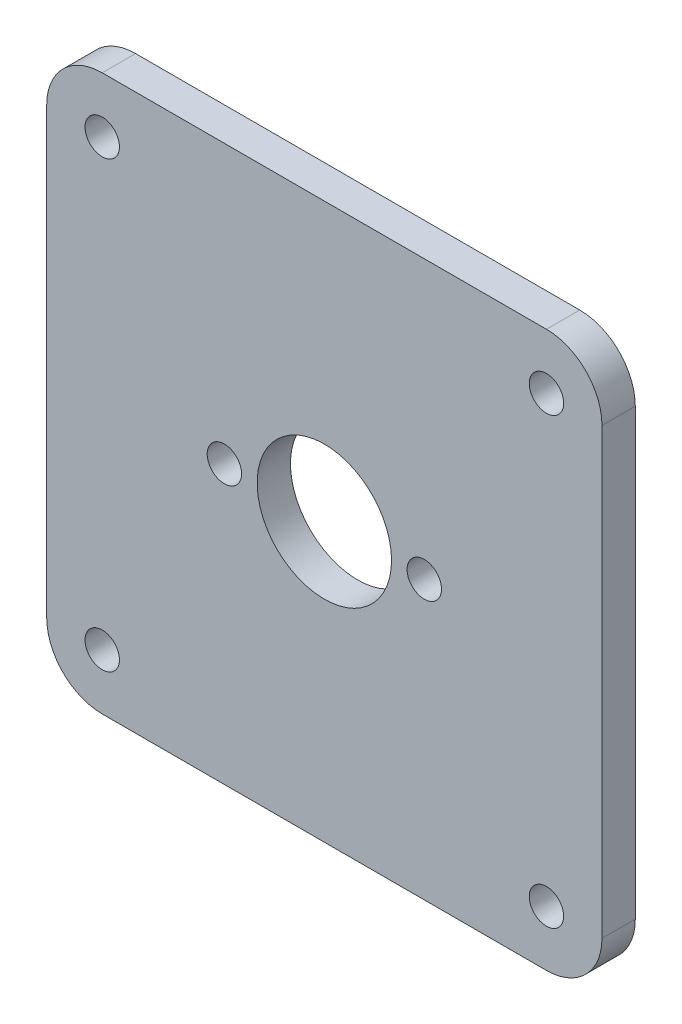
ISO-10303-21;
HEADER;
FILE_DESCRIPTION(('STEP AP214'),'2;1');
FILE_NAME('part.step','',(''),(''),'','','');
FILE_SCHEMA(('AUTOMOTIVE_DESIGN { 1 0 10303 214 1 1 1 1 }'));
ENDSEC;
DATA;
#1=APPLICATION_CONTEXT('core data for automotive mechanical design processes');
#2=APPLICATION_PROTOCOL_DEFINITION('international standard','automotive_design',2000,#1);
#3=PRODUCT_CONTEXT('',#1,'mechanical');
#4=PRODUCT('Part','Part','',(#3));
#5=PRODUCT_RELATED_PRODUCT_CATEGORY('part','',(#4));
#6=PRODUCT_DEFINITION_FORMATION('','',#4);
#7=PRODUCT_DEFINITION_CONTEXT('part definition',#1,'design');
#8=PRODUCT_DEFINITION('design','',#6,#7);
#9=PRODUCT_DEFINITION_SHAPE('','',#8);
#10=(LENGTH_UNIT() NAMED_UNIT(*) SI_UNIT(.MILLI.,.METRE.));
#11=(NAMED_UNIT(*) PLANE_ANGLE_UNIT() SI_UNIT($,.RADIAN.));
#12=(NAMED_UNIT(*) SI_UNIT($,.STERADIAN.) SOLID_ANGLE_UNIT());
#13=UNCERTAINTY_MEASURE_WITH_UNIT(LENGTH_MEASURE(1.E-05),#10,'distance_accuracy_value','');
#14=(GEOMETRIC_REPRESENTATION_CONTEXT(3) GLOBAL_UNCERTAINTY_ASSIGNED_CONTEXT((#13)) GLOBAL_UNIT_ASSIGNED_CONTEXT((#10,
#11,#12)) REPRESENTATION_CONTEXT('',''));
#15=CARTESIAN_POINT('',(0.,0.,0.));
#16=DIRECTION('',(0.,0.,1.));
#17=DIRECTION('',(1.,0.,0.));
#18=AXIS2_PLACEMENT_3D('',#15,#16,#17);
#19=CARTESIAN_POINT('',(0.,0.,3.));
#20=DIRECTION('',(0.,0.,1.));
#21=DIRECTION('',(1.,0.,0.));
#22=AXIS2_PLACEMENT_3D('',#19,#20,#21);
#23=PLANE('',#22);
#24=CARTESIAN_POINT('',(0.,0.,3.));
#25=DIRECTION('',(0.,0.,1.));
#26=DIRECTION('',(1.,0.,0.));
#27=AXIS2_PLACEMENT_3D('',#24,#25,#26);
#28=CIRCLE('',#27,6.05);
#29=CARTESIAN_POINT('',(6.05,0.,3.));
#30=VERTEX_POINT('',#29);
#31=EDGE_CURVE('E269',#30,#30,#28,.T.);
#32=ORIENTED_EDGE('',*,*,#31,.F.);
#33=EDGE_LOOP('',(#32));
#34=FACE_BOUND('',#33,.T.);
#35=CARTESIAN_POINT('',(20.,-20.,3.));
#36=DIRECTION('',(0.,0.,1.));
#37=DIRECTION('',(1.,0.,0.));
#38=AXIS2_PLACEMENT_3D('',#35,#36,#37);
#39=CIRCLE('',#38,1.55);
#40=CARTESIAN_POINT('',(21.55,-20.,3.));
#41=VERTEX_POINT('',#40);
#42=EDGE_CURVE('E285',#41,#41,#39,.T.);
#43=ORIENTED_EDGE('',*,*,#42,.F.);
#44=EDGE_LOOP('',(#43));
#45=FACE_BOUND('',#44,.T.);
#46=CARTESIAN_POINT('',(-9.,0.,3.));
#47=DIRECTION('',(0.,0.,1.));
#48=DIRECTION('',(1.,0.,0.));
#49=AXIS2_PLACEMENT_3D('',#46,#47,#48);
#50=CIRCLE('',#49,1.55);
#51=CARTESIAN_POINT('',(-7.45,0.,3.));
#52=VERTEX_POINT('',#51);
#53=EDGE_CURVE('E301',#52,#52,#50,.T.);
#54=ORIENTED_EDGE('',*,*,#53,.F.);
#55=EDGE_LOOP('',(#54));
#56=FACE_BOUND('',#55,.T.);
#57=DIRECTION('',(0.,-1.,0.));
#58=VECTOR('',#57,1.);
#59=CARTESIAN_POINT('',(-25.,25.,3.));
#60=LINE('',#59,#58);
#61=CARTESIAN_POINT('',(-25.,20.,3.));
#62=VERTEX_POINT('',#61);
#63=CARTESIAN_POINT('',(-25.,-20.,3.));
#64=VERTEX_POINT('',#63);
#65=EDGE_CURVE('E181',#62,#64,#60,.T.);
#66=ORIENTED_EDGE('',*,*,#65,.T.);
#67=CARTESIAN_POINT('',(-20.,-20.,3.));
#68=DIRECTION('',(0.,0.,1.));
#69=DIRECTION('',(1.,0.,0.));
#70=AXIS2_PLACEMENT_3D('',#67,#68,#69);
#71=CIRCLE('',#70,5.);
#72=CARTESIAN_POINT('',(-20.,-25.,3.));
#73=VERTEX_POINT('',#72);
#74=EDGE_CURVE('E169',#64,#73,#71,.T.);
#75=ORIENTED_EDGE('',*,*,#74,.T.);
#76=DIRECTION('',(1.,0.,0.));
#77=VECTOR('',#76,1.);
#78=CARTESIAN_POINT('',(-25.,-25.,3.));
#79=LINE('',#78,#77);
#80=CARTESIAN_POINT('',(20.,-25.,3.));
#81=VERTEX_POINT('',#80);
#82=EDGE_CURVE('E127',#73,#81,#79,.T.);
#83=ORIENTED_EDGE('',*,*,#82,.T.);
#84=CARTESIAN_POINT('',(20.,-20.,3.));
#85=DIRECTION('',(0.,0.,1.));
#86=DIRECTION('',(1.,0.,0.));
#87=AXIS2_PLACEMENT_3D('',#84,#85,#86);
#88=CIRCLE('',#87,5.);
#89=CARTESIAN_POINT('',(25.,-20.,3.));
#90=VERTEX_POINT('',#89);
#91=EDGE_CURVE('E166',#81,#90,#88,.T.);
#92=ORIENTED_EDGE('',*,*,#91,.T.);
#93=DIRECTION('',(0.,1.,0.));
#94=VECTOR('',#93,1.);
#95=CARTESIAN_POINT('',(25.,25.,3.));
#96=LINE('',#95,#94);
#97=CARTESIAN_POINT('',(25.,20.,3.));
#98=VERTEX_POINT('',#97);
#99=EDGE_CURVE('E136',#90,#98,#96,.T.);
#100=ORIENTED_EDGE('',*,*,#99,.T.);
#101=CARTESIAN_POINT('',(20.,20.,3.));
#102=DIRECTION('',(0.,0.,1.));
#103=DIRECTION('',(1.,0.,0.));
#104=AXIS2_PLACEMENT_3D('',#101,#102,#103);
#105=CIRCLE('',#104,5.);
#106=CARTESIAN_POINT('',(20.,25.,3.));
#107=VERTEX_POINT('',#106);
#108=EDGE_CURVE('E61',#98,#107,#105,.T.);
#109=ORIENTED_EDGE('',*,*,#108,.T.);
#110=DIRECTION('',(-1.,0.,0.));
#111=VECTOR('',#110,1.);
#112=CARTESIAN_POINT('',(-25.,25.,3.));
#113=LINE('',#112,#111);
#114=CARTESIAN_POINT('',(-20.,25.,3.));
#115=VERTEX_POINT('',#114);
#116=EDGE_CURVE('E141',#107,#115,#113,.T.);
#117=ORIENTED_EDGE('',*,*,#116,.T.);
#118=CARTESIAN_POINT('',(-20.,20.,3.));
#119=DIRECTION('',(0.,0.,1.));
#120=DIRECTION('',(1.,0.,0.));
#121=AXIS2_PLACEMENT_3D('',#118,#119,#120);
#122=CIRCLE('',#121,5.);
#123=EDGE_CURVE('E161',#115,#62,#122,.T.);
#124=ORIENTED_EDGE('',*,*,#123,.T.);
#125=EDGE_LOOP('',(#66,#75,#83,#92,#100,#109,#117,#124));
#126=FACE_BOUND('',#125,.T.);
#127=CARTESIAN_POINT('',(-20.,20.,3.));
#128=DIRECTION('',(0.,0.,1.));
#129=DIRECTION('',(1.,0.,0.));
#130=AXIS2_PLACEMENT_3D('',#127,#128,#129);
#131=CIRCLE('',#130,1.55);
#132=CARTESIAN_POINT('',(-18.45,20.,3.));
#133=VERTEX_POINT('',#132);
#134=EDGE_CURVE('E193',#133,#133,#131,.T.);
#135=ORIENTED_EDGE('',*,*,#134,.F.);
#136=EDGE_LOOP('',(#135));
#137=FACE_BOUND('',#136,.T.);
#138=CARTESIAN_POINT('',(20.,20.,3.));
#139=DIRECTION('',(0.,0.,1.));
#140=DIRECTION('',(1.,0.,0.));
#141=AXIS2_PLACEMENT_3D('',#138,#139,#140);
#142=CIRCLE('',#141,1.55);
#143=CARTESIAN_POINT('',(21.55,20.,3.));
#144=VERTEX_POINT('',#143);
#145=EDGE_CURVE('E293',#144,#144,#142,.T.);
#146=ORIENTED_EDGE('',*,*,#145,.F.);
#147=EDGE_LOOP('',(#146));
#148=FACE_BOUND('',#147,.T.);
#149=CARTESIAN_POINT('',(-20.,-20.,3.));
#150=DIRECTION('',(0.,0.,1.));
#151=DIRECTION('',(1.,0.,0.));
#152=AXIS2_PLACEMENT_3D('',#149,#150,#151);
#153=CIRCLE('',#152,1.55);
#154=CARTESIAN_POINT('',(-18.45,-20.,3.));
#155=VERTEX_POINT('',#154);
#156=EDGE_CURVE('E277',#155,#155,#153,.T.);
#157=ORIENTED_EDGE('',*,*,#156,.F.);
#158=EDGE_LOOP('',(#157));
#159=FACE_BOUND('',#158,.T.);
#160=CARTESIAN_POINT('',(9.,0.,3.));
#161=DIRECTION('',(0.,0.,1.));
#162=DIRECTION('',(-1.,0.,0.));
#163=AXIS2_PLACEMENT_3D('',#160,#161,#162);
#164=CIRCLE('',#163,1.55);
#165=CARTESIAN_POINT('',(7.45,0.,3.));
#166=VERTEX_POINT('',#165);
#167=EDGE_CURVE('E258',#166,#166,#164,.T.);
#168=ORIENTED_EDGE('',*,*,#167,.F.);
#169=EDGE_LOOP('',(#168));
#170=FACE_BOUND('',#169,.T.);
#171=ADVANCED_FACE('F39',(#34,#45,#56,#126,#137,#148,#159,#170),#23,.T.);
#172=CARTESIAN_POINT('',(0.,0.,0.));
#173=DIRECTION('',(0.,0.,1.));
#174=DIRECTION('',(1.,0.,0.));
#175=AXIS2_PLACEMENT_3D('',#172,#173,#174);
#176=PLANE('',#175);
#177=DIRECTION('',(1.,0.,0.));
#178=VECTOR('',#177,1.);
#179=CARTESIAN_POINT('',(-25.,-25.,0.));
#180=LINE('',#179,#178);
#181=CARTESIAN_POINT('',(-20.,-25.,0.));
#182=VERTEX_POINT('',#181);
#183=CARTESIAN_POINT('',(20.,-25.,0.));
#184=VERTEX_POINT('',#183);
#185=EDGE_CURVE('E124',#182,#184,#180,.T.);
#186=ORIENTED_EDGE('',*,*,#185,.F.);
#187=CARTESIAN_POINT('',(-20.,-20.,0.));
#188=DIRECTION('',(0.,0.,1.));
#189=DIRECTION('',(1.,0.,0.));
#190=AXIS2_PLACEMENT_3D('',#187,#188,#189);
#191=CIRCLE('',#190,5.);
#192=CARTESIAN_POINT('',(-25.,-20.,0.));
#193=VERTEX_POINT('',#192);
#194=EDGE_CURVE('E106',#182,#193,#191,.F.);
#195=ORIENTED_EDGE('',*,*,#194,.T.);
#196=DIRECTION('',(0.,-1.,0.));
#197=VECTOR('',#196,1.);
#198=CARTESIAN_POINT('',(-25.,25.,0.));
#199=LINE('',#198,#197);
#200=CARTESIAN_POINT('',(-25.,20.,0.));
#201=VERTEX_POINT('',#200);
#202=EDGE_CURVE('E137',#201,#193,#199,.T.);
#203=ORIENTED_EDGE('',*,*,#202,.F.);
#204=CARTESIAN_POINT('',(-20.,20.,0.));
#205=DIRECTION('',(0.,0.,1.));
#206=DIRECTION('',(1.,0.,0.));
#207=AXIS2_PLACEMENT_3D('',#204,#205,#206);
#208=CIRCLE('',#207,5.);
#209=CARTESIAN_POINT('',(-20.,25.,0.));
#210=VERTEX_POINT('',#209);
#211=EDGE_CURVE('E129',#201,#210,#208,.F.);
#212=ORIENTED_EDGE('',*,*,#211,.T.);
#213=DIRECTION('',(-1.,0.,0.));
#214=VECTOR('',#213,1.);
#215=CARTESIAN_POINT('',(-25.,25.,0.));
#216=LINE('',#215,#214);
#217=CARTESIAN_POINT('',(20.,25.,0.));
#218=VERTEX_POINT('',#217);
#219=EDGE_CURVE('E143',#218,#210,#216,.T.);
#220=ORIENTED_EDGE('',*,*,#219,.F.);
#221=CARTESIAN_POINT('',(20.,20.,0.));
#222=DIRECTION('',(0.,0.,1.));
#223=DIRECTION('',(1.,0.,0.));
#224=AXIS2_PLACEMENT_3D('',#221,#222,#223);
#225=CIRCLE('',#224,5.);
#226=CARTESIAN_POINT('',(25.,20.,0.));
#227=VERTEX_POINT('',#226);
#228=EDGE_CURVE('E151',#218,#227,#225,.F.);
#229=ORIENTED_EDGE('',*,*,#228,.T.);
#230=DIRECTION('',(0.,1.,0.));
#231=VECTOR('',#230,1.);
#232=CARTESIAN_POINT('',(25.,25.,0.));
#233=LINE('',#232,#231);
#234=CARTESIAN_POINT('',(25.,-20.,0.));
#235=VERTEX_POINT('',#234);
#236=EDGE_CURVE('E190',#235,#227,#233,.T.);
#237=ORIENTED_EDGE('',*,*,#236,.F.);
#238=CARTESIAN_POINT('',(20.,-20.,0.));
#239=DIRECTION('',(0.,0.,1.));
#240=DIRECTION('',(1.,0.,0.));
#241=AXIS2_PLACEMENT_3D('',#238,#239,#240);
#242=CIRCLE('',#241,5.);
#243=EDGE_CURVE('E118',#235,#184,#242,.F.);
#244=ORIENTED_EDGE('',*,*,#243,.T.);
#245=EDGE_LOOP('',(#186,#195,#203,#212,#220,#229,#237,#244));
#246=FACE_BOUND('',#245,.T.);
#247=CARTESIAN_POINT('',(-20.,20.,0.));
#248=DIRECTION('',(0.,0.,1.));
#249=DIRECTION('',(1.,0.,0.));
#250=AXIS2_PLACEMENT_3D('',#247,#248,#249);
#251=CIRCLE('',#250,1.55);
#252=CARTESIAN_POINT('',(-18.45,20.,0.));
#253=VERTEX_POINT('',#252);
#254=EDGE_CURVE('E305',#253,#253,#251,.T.);
#255=ORIENTED_EDGE('',*,*,#254,.T.);
#256=EDGE_LOOP('',(#255));
#257=FACE_BOUND('',#256,.T.);
#258=CARTESIAN_POINT('',(-9.,0.,0.));
#259=DIRECTION('',(0.,0.,1.));
#260=DIRECTION('',(1.,0.,0.));
#261=AXIS2_PLACEMENT_3D('',#258,#259,#260);
#262=CIRCLE('',#261,1.55);
#263=CARTESIAN_POINT('',(-7.45,0.,0.));
#264=VERTEX_POINT('',#263);
#265=EDGE_CURVE('E297',#264,#264,#262,.T.);
#266=ORIENTED_EDGE('',*,*,#265,.T.);
#267=EDGE_LOOP('',(#266));
#268=FACE_BOUND('',#267,.T.);
#269=CARTESIAN_POINT('',(20.,20.,0.));
#270=DIRECTION('',(0.,0.,1.));
#271=DIRECTION('',(1.,0.,0.));
#272=AXIS2_PLACEMENT_3D('',#269,#270,#271);
#273=CIRCLE('',#272,1.55);
#274=CARTESIAN_POINT('',(21.55,20.,0.));
#275=VERTEX_POINT('',#274);
#276=EDGE_CURVE('E289',#275,#275,#273,.T.);
#277=ORIENTED_EDGE('',*,*,#276,.T.);
#278=EDGE_LOOP('',(#277));
#279=FACE_BOUND('',#278,.T.);
#280=CARTESIAN_POINT('',(20.,-20.,0.));
#281=DIRECTION('',(0.,0.,1.));
#282=DIRECTION('',(1.,0.,0.));
#283=AXIS2_PLACEMENT_3D('',#280,#281,#282);
#284=CIRCLE('',#283,1.55);
#285=CARTESIAN_POINT('',(21.55,-20.,0.));
#286=VERTEX_POINT('',#285);
#287=EDGE_CURVE('E281',#286,#286,#284,.T.);
#288=ORIENTED_EDGE('',*,*,#287,.T.);
#289=EDGE_LOOP('',(#288));
#290=FACE_BOUND('',#289,.T.);
#291=CARTESIAN_POINT('',(-20.,-20.,0.));
#292=DIRECTION('',(0.,0.,1.));
#293=DIRECTION('',(1.,0.,0.));
#294=AXIS2_PLACEMENT_3D('',#291,#292,#293);
#295=CIRCLE('',#294,1.55);
#296=CARTESIAN_POINT('',(-18.45,-20.,0.));
#297=VERTEX_POINT('',#296);
#298=EDGE_CURVE('E273',#297,#297,#295,.T.);
#299=ORIENTED_EDGE('',*,*,#298,.T.);
#300=EDGE_LOOP('',(#299));
#301=FACE_BOUND('',#300,.T.);
#302=CARTESIAN_POINT('',(0.,0.,0.));
#303=DIRECTION('',(0.,0.,1.));
#304=DIRECTION('',(1.,0.,0.));
#305=AXIS2_PLACEMENT_3D('',#302,#303,#304);
#306=CIRCLE('',#305,6.05);
#307=CARTESIAN_POINT('',(6.05,0.,0.));
#308=VERTEX_POINT('',#307);
#309=EDGE_CURVE('E266',#308,#308,#306,.T.);
#310=ORIENTED_EDGE('',*,*,#309,.T.);
#311=EDGE_LOOP('',(#310));
#312=FACE_BOUND('',#311,.T.);
#313=CARTESIAN_POINT('',(9.,0.,0.));
#314=DIRECTION('',(0.,0.,1.));
#315=DIRECTION('',(-1.,0.,0.));
#316=AXIS2_PLACEMENT_3D('',#313,#314,#315);
#317=CIRCLE('',#316,1.55);
#318=CARTESIAN_POINT('',(7.45,0.,0.));
#319=VERTEX_POINT('',#318);
#320=EDGE_CURVE('E261',#319,#319,#317,.T.);
#321=ORIENTED_EDGE('',*,*,#320,.T.);
#322=EDGE_LOOP('',(#321));
#323=FACE_BOUND('',#322,.T.);
#324=ADVANCED_FACE('F132',(#246,#257,#268,#279,#290,#301,#312,#323),#176,.F.);
#325=CARTESIAN_POINT('',(25.,25.,3.));
#326=DIRECTION('',(-1.,0.,0.));
#327=DIRECTION('',(0.,-1.,0.));
#328=AXIS2_PLACEMENT_3D('',#325,#326,#327);
#329=PLANE('',#328);
#330=ORIENTED_EDGE('',*,*,#99,.F.);
#331=DIRECTION('',(0.,0.,-1.));
#332=VECTOR('',#331,1.);
#333=CARTESIAN_POINT('',(25.,-20.,3.));
#334=LINE('',#333,#332);
#335=EDGE_CURVE('E175',#90,#235,#334,.T.);
#336=ORIENTED_EDGE('',*,*,#335,.T.);
#337=ORIENTED_EDGE('',*,*,#236,.T.);
#338=DIRECTION('',(0.,0.,-1.));
#339=VECTOR('',#338,1.);
#340=CARTESIAN_POINT('',(25.,20.,3.));
#341=LINE('',#340,#339);
#342=EDGE_CURVE('E172',#227,#98,#341,.F.);
#343=ORIENTED_EDGE('',*,*,#342,.T.);
#344=EDGE_LOOP('',(#330,#336,#337,#343));
#345=FACE_BOUND('',#344,.T.);
#346=ADVANCED_FACE('F212',(#345),#329,.F.);
#347=CARTESIAN_POINT('',(-25.,25.,3.));
#348=DIRECTION('',(0.,-1.,0.));
#349=DIRECTION('',(0.,0.,-1.));
#350=AXIS2_PLACEMENT_3D('',#347,#348,#349);
#351=PLANE('',#350);
#352=ORIENTED_EDGE('',*,*,#116,.F.);
#353=DIRECTION('',(0.,0.,-1.));
#354=VECTOR('',#353,1.);
#355=CARTESIAN_POINT('',(20.,25.,3.));
#356=LINE('',#355,#354);
#357=EDGE_CURVE('E11',#107,#218,#356,.T.);
#358=ORIENTED_EDGE('',*,*,#357,.T.);
#359=ORIENTED_EDGE('',*,*,#219,.T.);
#360=DIRECTION('',(0.,0.,-1.));
#361=VECTOR('',#360,1.);
#362=CARTESIAN_POINT('',(-20.,25.,3.));
#363=LINE('',#362,#361);
#364=EDGE_CURVE('E48',#210,#115,#363,.F.);
#365=ORIENTED_EDGE('',*,*,#364,.T.);
#366=EDGE_LOOP('',(#352,#358,#359,#365));
#367=FACE_BOUND('',#366,.T.);
#368=ADVANCED_FACE('F196',(#367),#351,.F.);
#369=CARTESIAN_POINT('',(-25.,25.,3.));
#370=DIRECTION('',(1.,0.,0.));
#371=DIRECTION('',(0.,1.,0.));
#372=AXIS2_PLACEMENT_3D('',#369,#370,#371);
#373=PLANE('',#372);
#374=ORIENTED_EDGE('',*,*,#202,.T.);
#375=DIRECTION('',(0.,0.,-1.));
#376=VECTOR('',#375,1.);
#377=CARTESIAN_POINT('',(-25.,-20.,3.));
#378=LINE('',#377,#376);
#379=EDGE_CURVE('E111',#193,#64,#378,.F.);
#380=ORIENTED_EDGE('',*,*,#379,.T.);
#381=ORIENTED_EDGE('',*,*,#65,.F.);
#382=DIRECTION('',(0.,0.,-1.));
#383=VECTOR('',#382,1.);
#384=CARTESIAN_POINT('',(-25.,20.,3.));
#385=LINE('',#384,#383);
#386=EDGE_CURVE('E117',#62,#201,#385,.T.);
#387=ORIENTED_EDGE('',*,*,#386,.T.);
#388=EDGE_LOOP('',(#374,#380,#381,#387));
#389=FACE_BOUND('',#388,.T.);
#390=ADVANCED_FACE('F203',(#389),#373,.F.);
#391=CARTESIAN_POINT('',(-25.,-25.,3.));
#392=DIRECTION('',(0.,1.,0.));
#393=DIRECTION('',(0.,0.,1.));
#394=AXIS2_PLACEMENT_3D('',#391,#392,#393);
#395=PLANE('',#394);
#396=ORIENTED_EDGE('',*,*,#82,.F.);
#397=DIRECTION('',(0.,0.,-1.));
#398=VECTOR('',#397,1.);
#399=CARTESIAN_POINT('',(-20.,-25.,3.));
#400=LINE('',#399,#398);
#401=EDGE_CURVE('E110',#73,#182,#400,.T.);
#402=ORIENTED_EDGE('',*,*,#401,.T.);
#403=ORIENTED_EDGE('',*,*,#185,.T.);
#404=DIRECTION('',(0.,0.,-1.));
#405=VECTOR('',#404,1.);
#406=CARTESIAN_POINT('',(20.,-25.,3.));
#407=LINE('',#406,#405);
#408=EDGE_CURVE('E130',#184,#81,#407,.F.);
#409=ORIENTED_EDGE('',*,*,#408,.T.);
#410=EDGE_LOOP('',(#396,#402,#403,#409));
#411=FACE_BOUND('',#410,.T.);
#412=ADVANCED_FACE('F123',(#411),#395,.F.);
#413=CARTESIAN_POINT('',(-20.,20.,3.));
#414=DIRECTION('',(0.,0.,-1.));
#415=DIRECTION('',(-1.,0.,0.));
#416=AXIS2_PLACEMENT_3D('',#413,#414,#415);
#417=CYLINDRICAL_SURFACE('',#416,1.55);
#418=ORIENTED_EDGE('',*,*,#134,.T.);
#419=EDGE_LOOP('',(#418));
#420=FACE_BOUND('',#419,.T.);
#421=ORIENTED_EDGE('',*,*,#254,.F.);
#422=EDGE_LOOP('',(#421));
#423=FACE_BOUND('',#422,.T.);
#424=ADVANCED_FACE('F210',(#420,#423),#417,.F.);
#425=CARTESIAN_POINT('',(-9.,0.,3.));
#426=DIRECTION('',(0.,0.,-1.));
#427=DIRECTION('',(-1.,0.,0.));
#428=AXIS2_PLACEMENT_3D('',#425,#426,#427);
#429=CYLINDRICAL_SURFACE('',#428,1.55);
#430=ORIENTED_EDGE('',*,*,#53,.T.);
#431=EDGE_LOOP('',(#430));
#432=FACE_BOUND('',#431,.T.);
#433=ORIENTED_EDGE('',*,*,#265,.F.);
#434=EDGE_LOOP('',(#433));
#435=FACE_BOUND('',#434,.T.);
#436=ADVANCED_FACE('F226',(#432,#435),#429,.F.);
#437=CARTESIAN_POINT('',(20.,20.,3.));
#438=DIRECTION('',(0.,0.,-1.));
#439=DIRECTION('',(-1.,0.,0.));
#440=AXIS2_PLACEMENT_3D('',#437,#438,#439);
#441=CYLINDRICAL_SURFACE('',#440,1.55);
#442=ORIENTED_EDGE('',*,*,#145,.T.);
#443=EDGE_LOOP('',(#442));
#444=FACE_BOUND('',#443,.T.);
#445=ORIENTED_EDGE('',*,*,#276,.F.);
#446=EDGE_LOOP('',(#445));
#447=FACE_BOUND('',#446,.T.);
#448=ADVANCED_FACE('F230',(#444,#447),#441,.F.);
#449=CARTESIAN_POINT('',(20.,-20.,3.));
#450=DIRECTION('',(0.,0.,-1.));
#451=DIRECTION('',(-1.,0.,0.));
#452=AXIS2_PLACEMENT_3D('',#449,#450,#451);
#453=CYLINDRICAL_SURFACE('',#452,1.55);
#454=ORIENTED_EDGE('',*,*,#42,.T.);
#455=EDGE_LOOP('',(#454));
#456=FACE_BOUND('',#455,.T.);
#457=ORIENTED_EDGE('',*,*,#287,.F.);
#458=EDGE_LOOP('',(#457));
#459=FACE_BOUND('',#458,.T.);
#460=ADVANCED_FACE('F234',(#456,#459),#453,.F.);
#461=CARTESIAN_POINT('',(-20.,-20.,3.));
#462=DIRECTION('',(0.,0.,-1.));
#463=DIRECTION('',(-1.,0.,0.));
#464=AXIS2_PLACEMENT_3D('',#461,#462,#463);
#465=CYLINDRICAL_SURFACE('',#464,1.55);
#466=ORIENTED_EDGE('',*,*,#156,.T.);
#467=EDGE_LOOP('',(#466));
#468=FACE_BOUND('',#467,.T.);
#469=ORIENTED_EDGE('',*,*,#298,.F.);
#470=EDGE_LOOP('',(#469));
#471=FACE_BOUND('',#470,.T.);
#472=ADVANCED_FACE('F238',(#468,#471),#465,.F.);
#473=CARTESIAN_POINT('',(0.,0.,3.));
#474=DIRECTION('',(0.,0.,-1.));
#475=DIRECTION('',(-1.,0.,0.));
#476=AXIS2_PLACEMENT_3D('',#473,#474,#475);
#477=CYLINDRICAL_SURFACE('',#476,6.05);
#478=ORIENTED_EDGE('',*,*,#31,.T.);
#479=EDGE_LOOP('',(#478));
#480=FACE_BOUND('',#479,.T.);
#481=ORIENTED_EDGE('',*,*,#309,.F.);
#482=EDGE_LOOP('',(#481));
#483=FACE_BOUND('',#482,.T.);
#484=ADVANCED_FACE('F242',(#480,#483),#477,.F.);
#485=CARTESIAN_POINT('',(9.,0.,3.));
#486=DIRECTION('',(0.,0.,-1.));
#487=DIRECTION('',(-1.,0.,0.));
#488=AXIS2_PLACEMENT_3D('',#485,#486,#487);
#489=CYLINDRICAL_SURFACE('',#488,1.55);
#490=ORIENTED_EDGE('',*,*,#167,.T.);
#491=EDGE_LOOP('',(#490));
#492=FACE_BOUND('',#491,.T.);
#493=ORIENTED_EDGE('',*,*,#320,.F.);
#494=EDGE_LOOP('',(#493));
#495=FACE_BOUND('',#494,.T.);
#496=ADVANCED_FACE('F246',(#492,#495),#489,.F.);
#497=CARTESIAN_POINT('',(-20.,-20.,3.));
#498=DIRECTION('',(0.,0.,-1.));
#499=DIRECTION('',(-1.,0.,0.));
#500=AXIS2_PLACEMENT_3D('',#497,#498,#499);
#501=CYLINDRICAL_SURFACE('',#500,5.);
#502=ORIENTED_EDGE('',*,*,#74,.F.);
#503=ORIENTED_EDGE('',*,*,#379,.F.);
#504=ORIENTED_EDGE('',*,*,#194,.F.);
#505=ORIENTED_EDGE('',*,*,#401,.F.);
#506=EDGE_LOOP('',(#502,#503,#504,#505));
#507=FACE_BOUND('',#506,.T.);
#508=ADVANCED_FACE('F109',(#507),#501,.T.);
#509=CARTESIAN_POINT('',(20.,-20.,3.));
#510=DIRECTION('',(0.,0.,-1.));
#511=DIRECTION('',(-1.,0.,0.));
#512=AXIS2_PLACEMENT_3D('',#509,#510,#511);
#513=CYLINDRICAL_SURFACE('',#512,5.);
#514=ORIENTED_EDGE('',*,*,#91,.F.);
#515=ORIENTED_EDGE('',*,*,#408,.F.);
#516=ORIENTED_EDGE('',*,*,#243,.F.);
#517=ORIENTED_EDGE('',*,*,#335,.F.);
#518=EDGE_LOOP('',(#514,#515,#516,#517));
#519=FACE_BOUND('',#518,.T.);
#520=ADVANCED_FACE('F253',(#519),#513,.T.);
#521=CARTESIAN_POINT('',(20.,20.,3.));
#522=DIRECTION('',(0.,0.,-1.));
#523=DIRECTION('',(-1.,0.,0.));
#524=AXIS2_PLACEMENT_3D('',#521,#522,#523);
#525=CYLINDRICAL_SURFACE('',#524,5.);
#526=ORIENTED_EDGE('',*,*,#108,.F.);
#527=ORIENTED_EDGE('',*,*,#342,.F.);
#528=ORIENTED_EDGE('',*,*,#228,.F.);
#529=ORIENTED_EDGE('',*,*,#357,.F.);
#530=EDGE_LOOP('',(#526,#527,#528,#529));
#531=FACE_BOUND('',#530,.T.);
#532=ADVANCED_FACE('F342',(#531),#525,.T.);
#533=CARTESIAN_POINT('',(-20.,20.,3.));
#534=DIRECTION('',(0.,0.,-1.));
#535=DIRECTION('',(-1.,0.,0.));
#536=AXIS2_PLACEMENT_3D('',#533,#534,#535);
#537=CYLINDRICAL_SURFACE('',#536,5.);
#538=ORIENTED_EDGE('',*,*,#123,.F.);
#539=ORIENTED_EDGE('',*,*,#364,.F.);
#540=ORIENTED_EDGE('',*,*,#211,.F.);
#541=ORIENTED_EDGE('',*,*,#386,.F.);
#542=EDGE_LOOP('',(#538,#539,#540,#541));
#543=FACE_BOUND('',#542,.T.);
#544=ADVANCED_FACE('F41',(#543),#537,.T.);
#545=CLOSED_SHELL('',(#171,#324,#346,#368,#390,#412,#424,#436,#448,#460,#472,#484,#496,#508,
#520,#532,#544));
#546=MANIFOLD_SOLID_BREP('B2',#545);
#547=ADVANCED_BREP_SHAPE_REPRESENTATION('',(#18,#546),#14);
#548=SHAPE_DEFINITION_REPRESENTATION(#9,#547);
ENDSEC;
END-ISO-10303-21;
